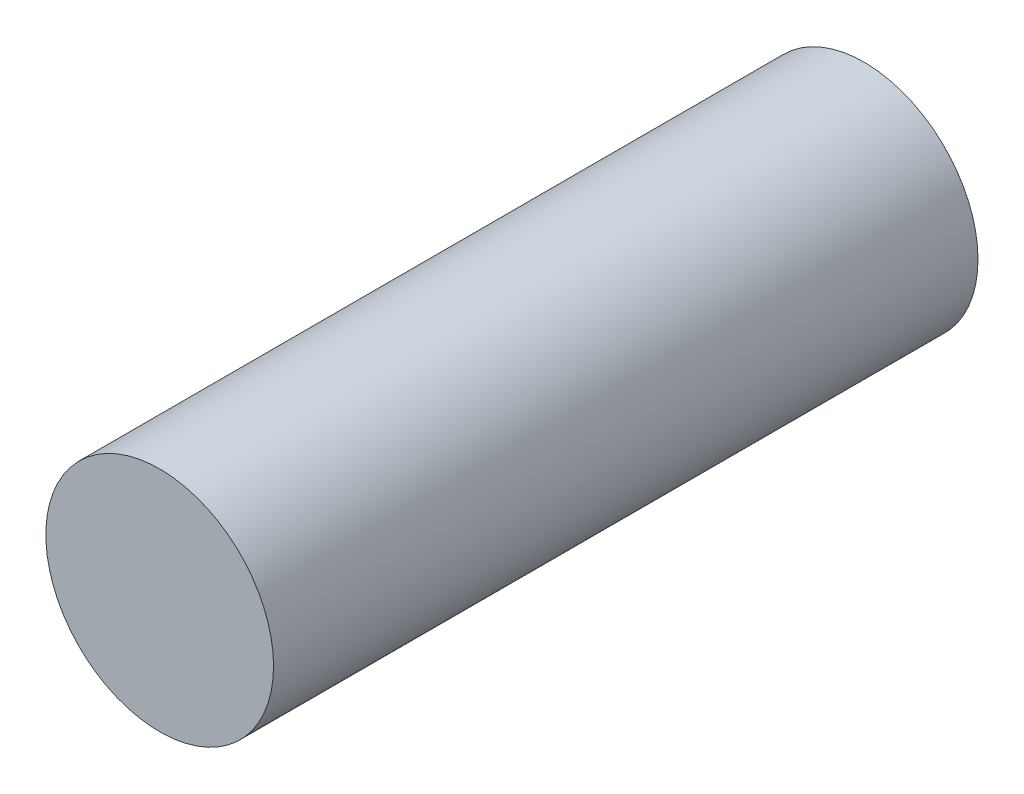
ISO-10303-21;
HEADER;
FILE_DESCRIPTION(('STEP AP214'),'2;1');
FILE_NAME('part.step','',(''),(''),'','','');
FILE_SCHEMA(('AUTOMOTIVE_DESIGN { 1 0 10303 214 1 1 1 1 }'));
ENDSEC;
DATA;
#1=APPLICATION_CONTEXT('core data for automotive mechanical design processes');
#2=APPLICATION_PROTOCOL_DEFINITION('international standard','automotive_design',2000,#1);
#3=PRODUCT_CONTEXT('',#1,'mechanical');
#4=PRODUCT('Part','Part','',(#3));
#5=PRODUCT_RELATED_PRODUCT_CATEGORY('part','',(#4));
#6=PRODUCT_DEFINITION_FORMATION('','',#4);
#7=PRODUCT_DEFINITION_CONTEXT('part definition',#1,'design');
#8=PRODUCT_DEFINITION('design','',#6,#7);
#9=PRODUCT_DEFINITION_SHAPE('','',#8);
#10=(LENGTH_UNIT() NAMED_UNIT(*) SI_UNIT(.MILLI.,.METRE.));
#11=(NAMED_UNIT(*) PLANE_ANGLE_UNIT() SI_UNIT($,.RADIAN.));
#12=(NAMED_UNIT(*) SI_UNIT($,.STERADIAN.) SOLID_ANGLE_UNIT());
#13=UNCERTAINTY_MEASURE_WITH_UNIT(LENGTH_MEASURE(1.E-05),#10,'distance_accuracy_value','');
#14=(GEOMETRIC_REPRESENTATION_CONTEXT(3) GLOBAL_UNCERTAINTY_ASSIGNED_CONTEXT((#13)) GLOBAL_UNIT_ASSIGNED_CONTEXT((#10,
#11,#12)) REPRESENTATION_CONTEXT('',''));
#15=CARTESIAN_POINT('',(0.,0.,0.));
#16=DIRECTION('',(0.,0.,1.));
#17=DIRECTION('',(1.,0.,0.));
#18=AXIS2_PLACEMENT_3D('',#15,#16,#17);
#19=CARTESIAN_POINT('',(-0.999999999999999,0.,1.));
#20=DIRECTION('',(0.,0.,-1.));
#21=DIRECTION('',(-1.,0.,0.));
#22=AXIS2_PLACEMENT_3D('',#19,#20,#21);
#23=CYLINDRICAL_SURFACE('',#22,0.323232353663545);
#24=CARTESIAN_POINT('',(-0.999999999999999,0.,1.));
#25=DIRECTION('',(0.,0.,1.));
#26=DIRECTION('',(1.,0.,0.));
#27=AXIS2_PLACEMENT_3D('',#24,#25,#26);
#28=CIRCLE('',#27,0.323232353663545);
#29=CARTESIAN_POINT('',(-0.676767646336454,0.,1.));
#30=VERTEX_POINT('',#29);
#31=EDGE_CURVE('E10',#30,#30,#28,.T.);
#32=ORIENTED_EDGE('',*,*,#31,.F.);
#33=EDGE_LOOP('',(#32));
#34=FACE_BOUND('',#33,.T.);
#35=CARTESIAN_POINT('',(-0.999999999999999,0.,-1.));
#36=DIRECTION('',(0.,0.,1.));
#37=DIRECTION('',(1.,0.,0.));
#38=AXIS2_PLACEMENT_3D('',#35,#36,#37);
#39=CIRCLE('',#38,0.323232353663545);
#40=CARTESIAN_POINT('',(-0.676767646336454,0.,-1.));
#41=VERTEX_POINT('',#40);
#42=EDGE_CURVE('E36',#41,#41,#39,.T.);
#43=ORIENTED_EDGE('',*,*,#42,.T.);
#44=EDGE_LOOP('',(#43));
#45=FACE_BOUND('',#44,.T.);
#46=ADVANCED_FACE('F33',(#34,#45),#23,.T.);
#47=CARTESIAN_POINT('',(-0.999999999999999,0.,1.));
#48=DIRECTION('',(0.,0.,1.));
#49=DIRECTION('',(1.,0.,0.));
#50=AXIS2_PLACEMENT_3D('',#47,#48,#49);
#51=PLANE('',#50);
#52=ORIENTED_EDGE('',*,*,#31,.T.);
#53=EDGE_LOOP('',(#52));
#54=FACE_BOUND('',#53,.T.);
#55=ADVANCED_FACE('F48',(#54),#51,.T.);
#56=CARTESIAN_POINT('',(-0.999999999999999,0.,-1.));
#57=DIRECTION('',(0.,0.,1.));
#58=DIRECTION('',(1.,0.,0.));
#59=AXIS2_PLACEMENT_3D('',#56,#57,#58);
#60=PLANE('',#59);
#61=ORIENTED_EDGE('',*,*,#42,.F.);
#62=EDGE_LOOP('',(#61));
#63=FACE_BOUND('',#62,.T.);
#64=ADVANCED_FACE('F46',(#63),#60,.F.);
#65=CLOSED_SHELL('',(#46,#55,#64));
#66=MANIFOLD_SOLID_BREP('B2',#65);
#67=ADVANCED_BREP_SHAPE_REPRESENTATION('',(#18,#66),#14);
#68=SHAPE_DEFINITION_REPRESENTATION(#9,#67);
ENDSEC;
END-ISO-10303-21;
